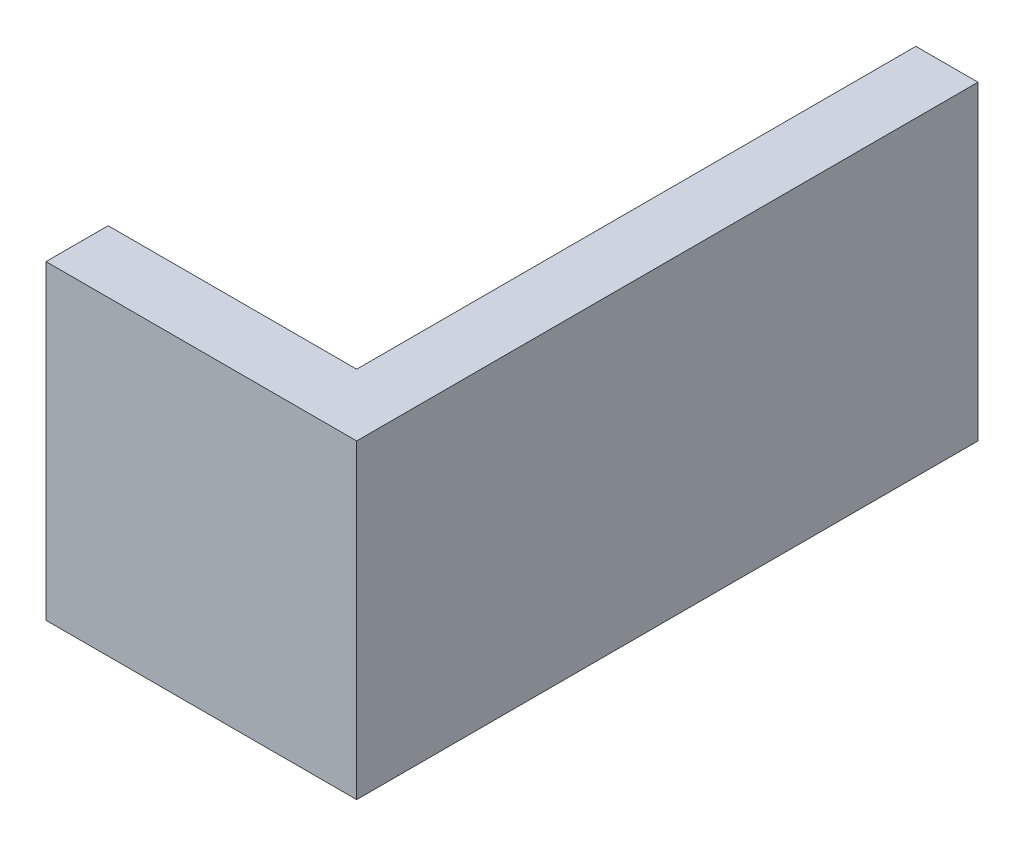
ISO-10303-21;
HEADER;
FILE_DESCRIPTION(('STEP AP214'),'2;1');
FILE_NAME('part.step','',(''),(''),'','','');
FILE_SCHEMA(('AUTOMOTIVE_DESIGN { 1 0 10303 214 1 1 1 1 }'));
ENDSEC;
DATA;
#1=APPLICATION_CONTEXT('core data for automotive mechanical design processes');
#2=APPLICATION_PROTOCOL_DEFINITION('international standard','automotive_design',2000,#1);
#3=PRODUCT_CONTEXT('',#1,'mechanical');
#4=PRODUCT('Part','Part','',(#3));
#5=PRODUCT_RELATED_PRODUCT_CATEGORY('part','',(#4));
#6=PRODUCT_DEFINITION_FORMATION('','',#4);
#7=PRODUCT_DEFINITION_CONTEXT('part definition',#1,'design');
#8=PRODUCT_DEFINITION('design','',#6,#7);
#9=PRODUCT_DEFINITION_SHAPE('','',#8);
#10=(LENGTH_UNIT() NAMED_UNIT(*) SI_UNIT(.MILLI.,.METRE.));
#11=(NAMED_UNIT(*) PLANE_ANGLE_UNIT() SI_UNIT($,.RADIAN.));
#12=(NAMED_UNIT(*) SI_UNIT($,.STERADIAN.) SOLID_ANGLE_UNIT());
#13=UNCERTAINTY_MEASURE_WITH_UNIT(LENGTH_MEASURE(1.E-05),#10,'distance_accuracy_value','');
#14=(GEOMETRIC_REPRESENTATION_CONTEXT(3) GLOBAL_UNCERTAINTY_ASSIGNED_CONTEXT((#13)) GLOBAL_UNIT_ASSIGNED_CONTEXT((#10,
#11,#12)) REPRESENTATION_CONTEXT('',''));
#15=CARTESIAN_POINT('',(0.,0.,0.));
#16=DIRECTION('',(0.,0.,1.));
#17=DIRECTION('',(1.,0.,0.));
#18=AXIS2_PLACEMENT_3D('',#15,#16,#17);
#19=CARTESIAN_POINT('',(-10.16,12.7,0.));
#20=DIRECTION('',(0.,0.,1.));
#21=DIRECTION('',(1.,0.,0.));
#22=AXIS2_PLACEMENT_3D('',#19,#20,#21);
#23=PLANE('',#22);
#24=DIRECTION('',(-1.,0.,0.));
#25=VECTOR('',#24,1.);
#26=CARTESIAN_POINT('',(-10.16,0.,0.));
#27=LINE('',#26,#25);
#28=CARTESIAN_POINT('',(0.,0.,0.));
#29=VERTEX_POINT('',#28);
#30=CARTESIAN_POINT('',(-10.16,0.,0.));
#31=VERTEX_POINT('',#30);
#32=EDGE_CURVE('E116',#29,#31,#27,.T.);
#33=ORIENTED_EDGE('',*,*,#32,.T.);
#34=DIRECTION('',(0.,-1.,0.));
#35=VECTOR('',#34,1.);
#36=CARTESIAN_POINT('',(-10.16,12.7,0.));
#37=LINE('',#36,#35);
#38=CARTESIAN_POINT('',(-10.16,12.7,0.));
#39=VERTEX_POINT('',#38);
#40=EDGE_CURVE('E11',#39,#31,#37,.T.);
#41=ORIENTED_EDGE('',*,*,#40,.F.);
#42=DIRECTION('',(-1.,0.,0.));
#43=VECTOR('',#42,1.);
#44=CARTESIAN_POINT('',(-10.16,12.7,0.));
#45=LINE('',#44,#43);
#46=CARTESIAN_POINT('',(0.,12.7,0.));
#47=VERTEX_POINT('',#46);
#48=EDGE_CURVE('E126',#47,#39,#45,.T.);
#49=ORIENTED_EDGE('',*,*,#48,.F.);
#50=DIRECTION('',(0.,-1.,0.));
#51=VECTOR('',#50,1.);
#52=CARTESIAN_POINT('',(0.,12.7,0.));
#53=LINE('',#52,#51);
#54=EDGE_CURVE('E112',#47,#29,#53,.T.);
#55=ORIENTED_EDGE('',*,*,#54,.T.);
#56=EDGE_LOOP('',(#33,#41,#49,#55));
#57=FACE_BOUND('',#56,.T.);
#58=ADVANCED_FACE('F32',(#57),#23,.F.);
#59=CARTESIAN_POINT('',(-10.16,12.7,2.54));
#60=DIRECTION('',(1.,0.,0.));
#61=DIRECTION('',(0.,0.,-1.));
#62=AXIS2_PLACEMENT_3D('',#59,#60,#61);
#63=PLANE('',#62);
#64=DIRECTION('',(0.,0.,1.));
#65=VECTOR('',#64,1.);
#66=CARTESIAN_POINT('',(-10.16,0.,2.54));
#67=LINE('',#66,#65);
#68=CARTESIAN_POINT('',(-10.16,0.,2.54));
#69=VERTEX_POINT('',#68);
#70=EDGE_CURVE('E119',#31,#69,#67,.T.);
#71=ORIENTED_EDGE('',*,*,#70,.T.);
#72=DIRECTION('',(0.,-1.,0.));
#73=VECTOR('',#72,1.);
#74=CARTESIAN_POINT('',(-10.16,12.7,2.54));
#75=LINE('',#74,#73);
#76=CARTESIAN_POINT('',(-10.16,12.7,2.54));
#77=VERTEX_POINT('',#76);
#78=EDGE_CURVE('E40',#77,#69,#75,.T.);
#79=ORIENTED_EDGE('',*,*,#78,.F.);
#80=DIRECTION('',(0.,0.,1.));
#81=VECTOR('',#80,1.);
#82=CARTESIAN_POINT('',(-10.16,12.7,2.54));
#83=LINE('',#82,#81);
#84=EDGE_CURVE('E85',#39,#77,#83,.T.);
#85=ORIENTED_EDGE('',*,*,#84,.F.);
#86=ORIENTED_EDGE('',*,*,#40,.T.);
#87=EDGE_LOOP('',(#71,#79,#85,#86));
#88=FACE_BOUND('',#87,.T.);
#89=ADVANCED_FACE('F150',(#88),#63,.F.);
#90=CARTESIAN_POINT('',(2.54,12.7,2.54));
#91=DIRECTION('',(0.,0.,-1.));
#92=DIRECTION('',(-1.,0.,0.));
#93=AXIS2_PLACEMENT_3D('',#90,#91,#92);
#94=PLANE('',#93);
#95=DIRECTION('',(1.,0.,0.));
#96=VECTOR('',#95,1.);
#97=CARTESIAN_POINT('',(2.54,0.,2.54));
#98=LINE('',#97,#96);
#99=CARTESIAN_POINT('',(2.54,0.,2.54));
#100=VERTEX_POINT('',#99);
#101=EDGE_CURVE('E121',#69,#100,#98,.T.);
#102=ORIENTED_EDGE('',*,*,#101,.T.);
#103=DIRECTION('',(0.,-1.,0.));
#104=VECTOR('',#103,1.);
#105=CARTESIAN_POINT('',(2.54,12.7,2.54));
#106=LINE('',#105,#104);
#107=CARTESIAN_POINT('',(2.54,12.7,2.54));
#108=VERTEX_POINT('',#107);
#109=EDGE_CURVE('E107',#108,#100,#106,.T.);
#110=ORIENTED_EDGE('',*,*,#109,.F.);
#111=DIRECTION('',(1.,0.,0.));
#112=VECTOR('',#111,1.);
#113=CARTESIAN_POINT('',(2.54,12.7,2.54));
#114=LINE('',#113,#112);
#115=EDGE_CURVE('E98',#77,#108,#114,.T.);
#116=ORIENTED_EDGE('',*,*,#115,.F.);
#117=ORIENTED_EDGE('',*,*,#78,.T.);
#118=EDGE_LOOP('',(#102,#110,#116,#117));
#119=FACE_BOUND('',#118,.T.);
#120=ADVANCED_FACE('F132',(#119),#94,.F.);
#121=CARTESIAN_POINT('',(2.54,12.7,-22.86));
#122=DIRECTION('',(-1.,0.,0.));
#123=DIRECTION('',(0.,0.,1.));
#124=AXIS2_PLACEMENT_3D('',#121,#122,#123);
#125=PLANE('',#124);
#126=DIRECTION('',(0.,0.,-1.));
#127=VECTOR('',#126,1.);
#128=CARTESIAN_POINT('',(2.54,0.,-22.86));
#129=LINE('',#128,#127);
#130=CARTESIAN_POINT('',(2.54,0.,-22.86));
#131=VERTEX_POINT('',#130);
#132=EDGE_CURVE('E106',#100,#131,#129,.T.);
#133=ORIENTED_EDGE('',*,*,#132,.T.);
#134=DIRECTION('',(0.,-1.,0.));
#135=VECTOR('',#134,1.);
#136=CARTESIAN_POINT('',(2.54,12.7,-22.86));
#137=LINE('',#136,#135);
#138=CARTESIAN_POINT('',(2.54,12.7,-22.86));
#139=VERTEX_POINT('',#138);
#140=EDGE_CURVE('E103',#139,#131,#137,.T.);
#141=ORIENTED_EDGE('',*,*,#140,.F.);
#142=DIRECTION('',(0.,0.,-1.));
#143=VECTOR('',#142,1.);
#144=CARTESIAN_POINT('',(2.54,12.7,-22.86));
#145=LINE('',#144,#143);
#146=EDGE_CURVE('E92',#108,#139,#145,.T.);
#147=ORIENTED_EDGE('',*,*,#146,.F.);
#148=ORIENTED_EDGE('',*,*,#109,.T.);
#149=EDGE_LOOP('',(#133,#141,#147,#148));
#150=FACE_BOUND('',#149,.T.);
#151=ADVANCED_FACE('F104',(#150),#125,.F.);
#152=CARTESIAN_POINT('',(0.,12.7,-22.86));
#153=DIRECTION('',(0.,0.,1.));
#154=DIRECTION('',(1.,0.,0.));
#155=AXIS2_PLACEMENT_3D('',#152,#153,#154);
#156=PLANE('',#155);
#157=DIRECTION('',(-1.,0.,0.));
#158=VECTOR('',#157,1.);
#159=CARTESIAN_POINT('',(0.,0.,-22.86));
#160=LINE('',#159,#158);
#161=CARTESIAN_POINT('',(0.,0.,-22.86));
#162=VERTEX_POINT('',#161);
#163=EDGE_CURVE('E71',#131,#162,#160,.T.);
#164=ORIENTED_EDGE('',*,*,#163,.T.);
#165=DIRECTION('',(0.,-1.,0.));
#166=VECTOR('',#165,1.);
#167=CARTESIAN_POINT('',(0.,12.7,-22.86));
#168=LINE('',#167,#166);
#169=CARTESIAN_POINT('',(0.,12.7,-22.86));
#170=VERTEX_POINT('',#169);
#171=EDGE_CURVE('E108',#170,#162,#168,.T.);
#172=ORIENTED_EDGE('',*,*,#171,.F.);
#173=DIRECTION('',(-1.,0.,0.));
#174=VECTOR('',#173,1.);
#175=CARTESIAN_POINT('',(0.,12.7,-22.86));
#176=LINE('',#175,#174);
#177=EDGE_CURVE('E96',#139,#170,#176,.T.);
#178=ORIENTED_EDGE('',*,*,#177,.F.);
#179=ORIENTED_EDGE('',*,*,#140,.T.);
#180=EDGE_LOOP('',(#164,#172,#178,#179));
#181=FACE_BOUND('',#180,.T.);
#182=ADVANCED_FACE('F110',(#181),#156,.F.);
#183=CARTESIAN_POINT('',(0.,12.7,0.));
#184=DIRECTION('',(1.,0.,0.));
#185=DIRECTION('',(0.,0.,-1.));
#186=AXIS2_PLACEMENT_3D('',#183,#184,#185);
#187=PLANE('',#186);
#188=DIRECTION('',(0.,0.,1.));
#189=VECTOR('',#188,1.);
#190=CARTESIAN_POINT('',(0.,0.,0.));
#191=LINE('',#190,#189);
#192=EDGE_CURVE('E77',#162,#29,#191,.T.);
#193=ORIENTED_EDGE('',*,*,#192,.T.);
#194=ORIENTED_EDGE('',*,*,#54,.F.);
#195=DIRECTION('',(0.,0.,1.));
#196=VECTOR('',#195,1.);
#197=CARTESIAN_POINT('',(0.,12.7,0.));
#198=LINE('',#197,#196);
#199=EDGE_CURVE('E48',#170,#47,#198,.T.);
#200=ORIENTED_EDGE('',*,*,#199,.F.);
#201=ORIENTED_EDGE('',*,*,#171,.T.);
#202=EDGE_LOOP('',(#193,#194,#200,#201));
#203=FACE_BOUND('',#202,.T.);
#204=ADVANCED_FACE('F139',(#203),#187,.F.);
#205=CARTESIAN_POINT('',(0.,12.7,0.));
#206=DIRECTION('',(0.,1.,0.));
#207=DIRECTION('',(0.,0.,1.));
#208=AXIS2_PLACEMENT_3D('',#205,#206,#207);
#209=PLANE('',#208);
#210=ORIENTED_EDGE('',*,*,#48,.T.);
#211=ORIENTED_EDGE('',*,*,#84,.T.);
#212=ORIENTED_EDGE('',*,*,#115,.T.);
#213=ORIENTED_EDGE('',*,*,#146,.T.);
#214=ORIENTED_EDGE('',*,*,#177,.T.);
#215=ORIENTED_EDGE('',*,*,#199,.T.);
#216=EDGE_LOOP('',(#210,#211,#212,#213,#214,#215));
#217=FACE_BOUND('',#216,.T.);
#218=ADVANCED_FACE('F94',(#217),#209,.T.);
#219=CARTESIAN_POINT('',(0.,0.,0.));
#220=DIRECTION('',(0.,1.,0.));
#221=DIRECTION('',(0.,0.,1.));
#222=AXIS2_PLACEMENT_3D('',#219,#220,#221);
#223=PLANE('',#222);
#224=ORIENTED_EDGE('',*,*,#32,.F.);
#225=ORIENTED_EDGE('',*,*,#192,.F.);
#226=ORIENTED_EDGE('',*,*,#163,.F.);
#227=ORIENTED_EDGE('',*,*,#132,.F.);
#228=ORIENTED_EDGE('',*,*,#101,.F.);
#229=ORIENTED_EDGE('',*,*,#70,.F.);
#230=EDGE_LOOP('',(#224,#225,#226,#227,#228,#229));
#231=FACE_BOUND('',#230,.T.);
#232=ADVANCED_FACE('F135',(#231),#223,.F.);
#233=CLOSED_SHELL('',(#58,#89,#120,#151,#182,#204,#218,#232));
#234=MANIFOLD_SOLID_BREP('B2',#233);
#235=ADVANCED_BREP_SHAPE_REPRESENTATION('',(#18,#234),#14);
#236=SHAPE_DEFINITION_REPRESENTATION(#9,#235);
ENDSEC;
END-ISO-10303-21;
